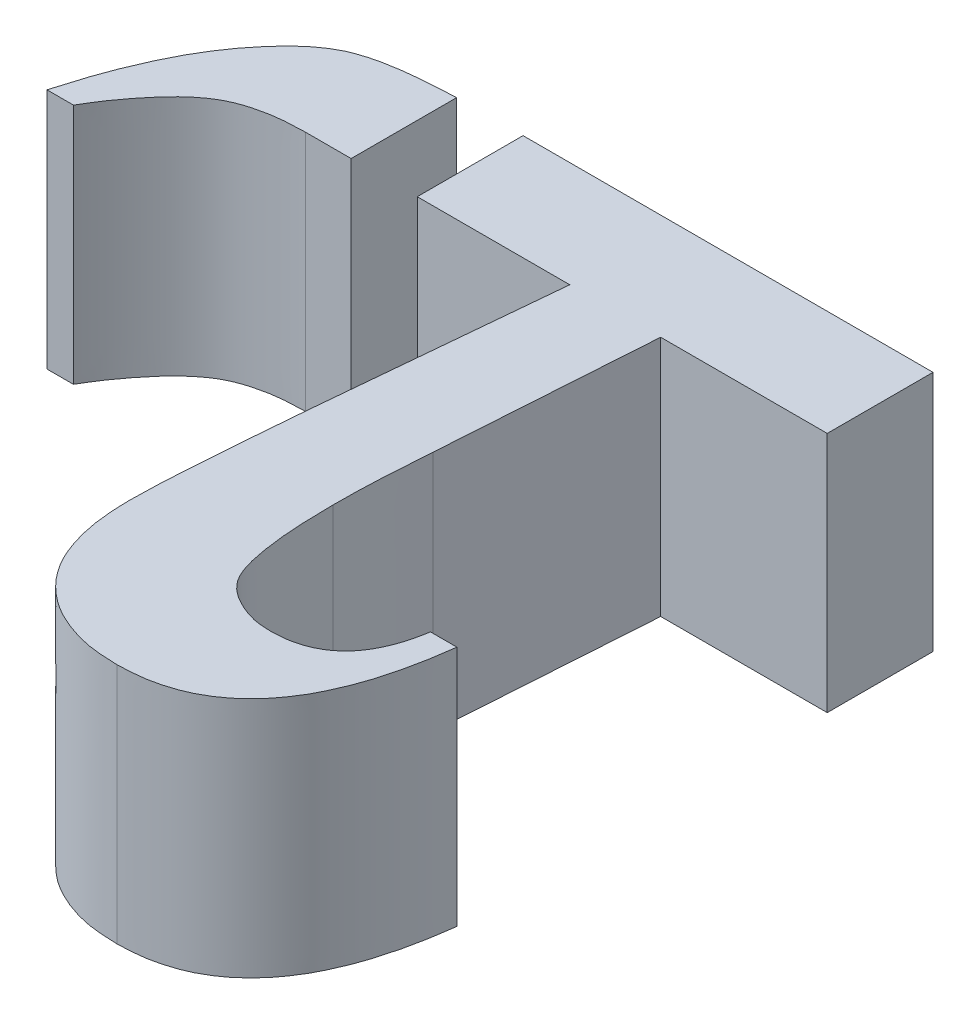
ISO-10303-21;
HEADER;
FILE_DESCRIPTION(('STEP AP214'),'2;1');
FILE_NAME('part.step','',(''),(''),'','','');
FILE_SCHEMA(('AUTOMOTIVE_DESIGN { 1 0 10303 214 1 1 1 1 }'));
ENDSEC;
DATA;
#1=APPLICATION_CONTEXT('core data for automotive mechanical design processes');
#2=APPLICATION_PROTOCOL_DEFINITION('international standard','automotive_design',2000,#1);
#3=PRODUCT_CONTEXT('',#1,'mechanical');
#4=PRODUCT('Part','Part','',(#3));
#5=PRODUCT_RELATED_PRODUCT_CATEGORY('part','',(#4));
#6=PRODUCT_DEFINITION_FORMATION('','',#4);
#7=PRODUCT_DEFINITION_CONTEXT('part definition',#1,'design');
#8=PRODUCT_DEFINITION('design','',#6,#7);
#9=PRODUCT_DEFINITION_SHAPE('','',#8);
#10=(LENGTH_UNIT() NAMED_UNIT(*) SI_UNIT(.MILLI.,.METRE.));
#11=(NAMED_UNIT(*) PLANE_ANGLE_UNIT() SI_UNIT($,.RADIAN.));
#12=(NAMED_UNIT(*) SI_UNIT($,.STERADIAN.) SOLID_ANGLE_UNIT());
#13=UNCERTAINTY_MEASURE_WITH_UNIT(LENGTH_MEASURE(1.E-05),#10,'distance_accuracy_value','');
#14=(GEOMETRIC_REPRESENTATION_CONTEXT(3) GLOBAL_UNCERTAINTY_ASSIGNED_CONTEXT((#13)) GLOBAL_UNIT_ASSIGNED_CONTEXT((#10,
#11,#12)) REPRESENTATION_CONTEXT('',''));
#15=CARTESIAN_POINT('',(0.,0.,0.));
#16=DIRECTION('',(0.,0.,1.));
#17=DIRECTION('',(1.,0.,0.));
#18=AXIS2_PLACEMENT_3D('',#15,#16,#17);
#19=CARTESIAN_POINT('',(13.2921006944444,12.7,-34.0277777777778));
#20=DIRECTION('',(0.,0.,-1.));
#21=DIRECTION('',(-1.,0.,0.));
#22=AXIS2_PLACEMENT_3D('',#19,#20,#21);
#23=PLANE('',#22);
#24=DIRECTION('',(1.,0.,0.));
#25=VECTOR('',#24,1.);
#26=CARTESIAN_POINT('',(13.2921006944444,0.,-34.0277777777778));
#27=LINE('',#26,#25);
#28=CARTESIAN_POINT('',(15.2777777777778,0.,-34.0277777777778));
#29=VERTEX_POINT('',#28);
#30=CARTESIAN_POINT('',(36.8055555555556,0.,-34.0277777777778));
#31=VERTEX_POINT('',#30);
#32=EDGE_CURVE('E150',#29,#31,#27,.T.);
#33=ORIENTED_EDGE('',*,*,#32,.F.);
#34=DIRECTION('',(0.,-1.,0.));
#35=VECTOR('',#34,1.);
#36=CARTESIAN_POINT('',(15.2777777777778,12.700012,-34.0277777777778));
#37=LINE('',#36,#35);
#38=CARTESIAN_POINT('',(15.2777777777778,12.7,-34.0277777777778));
#39=VERTEX_POINT('',#38);
#40=EDGE_CURVE('E12',#39,#29,#37,.T.);
#41=ORIENTED_EDGE('',*,*,#40,.F.);
#42=DIRECTION('',(1.,0.,0.));
#43=VECTOR('',#42,1.);
#44=CARTESIAN_POINT('',(13.2921006944444,12.7,-34.0277777777778));
#45=LINE('',#44,#43);
#46=CARTESIAN_POINT('',(36.8055555555556,12.7,-34.0277777777778));
#47=VERTEX_POINT('',#46);
#48=EDGE_CURVE('E148',#39,#47,#45,.T.);
#49=ORIENTED_EDGE('',*,*,#48,.T.);
#50=DIRECTION('',(0.,-1.,0.));
#51=VECTOR('',#50,1.);
#52=CARTESIAN_POINT('',(36.8055555555556,12.7,-34.0277777777778));
#53=LINE('',#52,#51);
#54=EDGE_CURVE('E156',#47,#31,#53,.T.);
#55=ORIENTED_EDGE('',*,*,#54,.T.);
#56=EDGE_LOOP('',(#33,#41,#49,#55));
#57=FACE_BOUND('',#56,.T.);
#58=ADVANCED_FACE('F43',(#57),#23,.T.);
#59=CARTESIAN_POINT('',(27.1472873942856,12.7,-14.7536617724148));
#60=DIRECTION('',(0.,-1.,0.));
#61=DIRECTION('',(0.,0.,-1.));
#62=AXIS2_PLACEMENT_3D('',#59,#60,#61);
#63=PLANE('',#62);
#64=DIRECTION('',(0.,0.,1.));
#65=VECTOR('',#64,1.);
#66=CARTESIAN_POINT('',(15.2777777777778,12.7,0.));
#67=LINE('',#66,#65);
#68=CARTESIAN_POINT('',(15.2777777777778,12.7,-28.4722222222222));
#69=VERTEX_POINT('',#68);
#70=EDGE_CURVE('E47',#69,#39,#67,.F.);
#71=ORIENTED_EDGE('',*,*,#70,.F.);
#72=DIRECTION('',(-1.,0.,0.));
#73=VECTOR('',#72,1.);
#74=CARTESIAN_POINT('',(23.2855902777778,12.7,-28.4722222222222));
#75=LINE('',#74,#73);
#76=CARTESIAN_POINT('',(23.2855902777778,12.7,-28.4722222222222));
#77=VERTEX_POINT('',#76);
#78=EDGE_CURVE('E200',#77,#69,#75,.T.);
#79=ORIENTED_EDGE('',*,*,#78,.F.);
#80=DIRECTION('',(0.0934043008907482,0.,-0.995628262242043));
#81=VECTOR('',#80,1.);
#82=CARTESIAN_POINT('',(22.2981770833333,12.7,-17.9470486111111));
#83=LINE('',#82,#81);
#84=CARTESIAN_POINT('',(22.2981770833333,12.7,-17.9470486111111));
#85=VERTEX_POINT('',#84);
#86=EDGE_CURVE('E193',#85,#77,#83,.T.);
#87=ORIENTED_EDGE('',*,*,#86,.F.);
#88=CARTESIAN_POINT('',(21.5277777777778,12.7,-7.12890625));
#89=CARTESIAN_POINT('',(21.5305114105295,12.7,-7.3712541198442));
#90=CARTESIAN_POINT('',(21.5366740874699,12.7,-7.91760096473992));
#91=CARTESIAN_POINT('',(21.5693216726704,12.7,-8.8258732238135));
#92=CARTESIAN_POINT('',(21.639359606474,12.7,-9.91058564289095));
#93=CARTESIAN_POINT('',(21.7259965981165,12.7,-11.1729046276854));
#94=CARTESIAN_POINT('',(21.83463501765,12.7,-12.6124561829459));
#95=CARTESIAN_POINT('',(21.9665895696574,12.7,-14.2326908476133));
#96=CARTESIAN_POINT('',(22.1147351358337,12.7,-16.0309685855275));
#97=CARTESIAN_POINT('',(22.2351680357019,12.7,-17.2889091874774));
#98=CARTESIAN_POINT('',(22.2981770833333,12.7,-17.9470486111111));
#99=B_SPLINE_CURVE_WITH_KNOTS('',3,(#88,#89,#90,#91,#92,#93,#94,#95,#96,#97,#98),.UNSPECIFIED.,
.F.,.F.,(4,1,1,1,1,1,1,1,4),(0.,0.0670238303360388,0.151097916645444,0.251302226093075,
0.367606163812109,0.501014153754002,0.65053310860966,0.817163117143853,1.),.UNSPECIFIED.);
#100=CARTESIAN_POINT('',(21.5277777777778,12.7,-7.12890625));
#101=VERTEX_POINT('',#100);
#102=EDGE_CURVE('E190',#101,#85,#99,.T.);
#103=ORIENTED_EDGE('',*,*,#102,.F.);
#104=CARTESIAN_POINT('',(28.6675347222222,12.7,0.694444444444444));
#105=CARTESIAN_POINT('',(28.1546828613466,12.7,0.675816782086769));
#106=CARTESIAN_POINT('',(27.1641312430192,12.7,0.639838242275));
#107=CARTESIAN_POINT('',(25.7663350443405,12.7,0.242024900702383));
#108=CARTESIAN_POINT('',(24.5121456190193,12.7,-0.369174112416068));
#109=CARTESIAN_POINT('',(23.6216090508016,12.7,-1.10102614918808));
#110=CARTESIAN_POINT('',(23.0102559111378,12.7,-1.79721088235984));
#111=CARTESIAN_POINT('',(22.6098523705465,12.7,-2.38381706075308));
#112=CARTESIAN_POINT('',(22.2684789361821,12.7,-3.03085897121243));
#113=CARTESIAN_POINT('',(22.0031010816414,12.7,-3.74048733214159));
#114=CARTESIAN_POINT('',(21.7829659020023,12.7,-4.50131584322859));
#115=CARTESIAN_POINT('',(21.632459474962,12.7,-5.32264207193387));
#116=CARTESIAN_POINT('',(21.5478756365024,12.7,-6.20479876889942));
#117=CARTESIAN_POINT('',(21.534625409571,12.7,-6.81404943591648));
#118=CARTESIAN_POINT('',(21.5277777777778,12.7,-7.12890625));
#119=B_SPLINE_CURVE_WITH_KNOTS('',3,(#104,#105,#106,#107,#108,#109,#110,#111,#112,#113,#114,
#115,#116,#117,#118),.UNSPECIFIED.,.F.,.F.,(4,1,1,1,1,1,1,1,1,1,1,1,4),(0.,0.127647226661698,
0.246545204552585,0.359563226304089,0.473742938345104,0.531308817831562,0.590390123598073,
0.650544045709061,0.713399872205537,0.779107018641923,0.847968041860642,0.921430864880289,1.),.UNSPECIFIED.);
#120=CARTESIAN_POINT('',(28.6675347222222,12.7,0.694444444444444));
#121=VERTEX_POINT('',#120);
#122=EDGE_CURVE('E187',#121,#101,#119,.T.);
#123=ORIENTED_EDGE('',*,*,#122,.F.);
#124=CARTESIAN_POINT('',(36.8055555555556,12.7,-9.02777777777778));
#125=CARTESIAN_POINT('',(36.7513133917469,12.7,-8.63659364157587));
#126=CARTESIAN_POINT('',(36.6454306414474,12.7,-7.87298744841802));
#127=CARTESIAN_POINT('',(36.4309932767515,12.7,-6.77107907621159));
#128=CARTESIAN_POINT('',(36.16669150045,12.7,-5.74350517199164));
#129=CARTESIAN_POINT('',(35.8738258854762,12.7,-4.78809617206142));
#130=CARTESIAN_POINT('',(35.5036386424438,12.7,-3.9183087219052));
#131=CARTESIAN_POINT('',(35.1264384283411,12.7,-3.10889015714418));
#132=CARTESIAN_POINT('',(34.6702223597116,12.7,-2.39005292028029));
#133=CARTESIAN_POINT('',(34.1904600364056,12.7,-1.73473575157518));
#134=CARTESIAN_POINT('',(33.6477015498479,12.7,-1.16770850492629));
#135=CARTESIAN_POINT('',(33.078282467188,12.7,-0.66136398505755));
#136=CARTESIAN_POINT('',(32.4475265168622,12.7,-0.251271838106295));
#137=CARTESIAN_POINT('',(31.7856191750121,12.7,0.107880779261864));
#138=CARTESIAN_POINT('',(31.0640591850801,12.7,0.356214557009295));
#139=CARTESIAN_POINT('',(30.3088261221695,12.7,0.56350053559861));
#140=CARTESIAN_POINT('',(29.5020634030454,12.7,0.664205140721047));
#141=CARTESIAN_POINT('',(28.9498434871648,12.7,0.684214933244837));
#142=CARTESIAN_POINT('',(28.6675347222222,12.7,0.694444444444444));
#143=B_SPLINE_CURVE_WITH_KNOTS('',3,(#124,#125,#126,#127,#128,#129,#130,#131,#132,#133,#134,
#135,#136,#137,#138,#139,#140,#141,#142),.UNSPECIFIED.,.F.,.F.,(4,1,1,1,1,1,1,1,1,1,1,1,1,1,1,1,
4),(0.,0.0841556864895232,0.164275075203153,0.239055219457782,0.310237014412085,
0.376941840256964,0.440373169741991,0.500263392341492,0.558073875988856,0.613147443853041,
0.667241364146044,0.720045825452029,0.773142026333451,0.827274375356327,0.882239955728648,
0.93979809184389,1.),.UNSPECIFIED.);
#144=CARTESIAN_POINT('',(36.8055555555556,12.7,-9.02777777777778));
#145=VERTEX_POINT('',#144);
#146=EDGE_CURVE('E184',#145,#121,#143,.T.);
#147=ORIENTED_EDGE('',*,*,#146,.F.);
#148=DIRECTION('',(1.,0.,0.));
#149=VECTOR('',#148,1.);
#150=CARTESIAN_POINT('',(35.4166666666667,12.7,-9.02777777777778));
#151=LINE('',#150,#149);
#152=CARTESIAN_POINT('',(35.4166666666667,12.7,-9.02777777777778));
#153=VERTEX_POINT('',#152);
#154=EDGE_CURVE('E181',#153,#145,#151,.T.);
#155=ORIENTED_EDGE('',*,*,#154,.F.);
#156=CARTESIAN_POINT('',(31.1957465277778,12.7,-4.86111111111111));
#157=CARTESIAN_POINT('',(31.4791658501184,12.7,-4.8721360880485));
#158=CARTESIAN_POINT('',(32.020929674091,12.7,-4.89321063446786));
#159=CARTESIAN_POINT('',(32.7882207905975,12.7,-5.09409905053723));
#160=CARTESIAN_POINT('',(33.4661075286299,12.7,-5.42321156735885));
#161=CARTESIAN_POINT('',(34.0525941602721,12.7,-5.89132585546645));
#162=CARTESIAN_POINT('',(34.5489539983316,12.7,-6.48840022572338));
#163=CARTESIAN_POINT('',(34.9362207251512,12.7,-7.22238630970373));
#164=CARTESIAN_POINT('',(35.2449863982341,12.7,-8.07647376134501));
#165=CARTESIAN_POINT('',(35.3574861135008,12.7,-8.69985018053333));
#166=CARTESIAN_POINT('',(35.4166666666667,12.7,-9.02777777777778));
#167=B_SPLINE_CURVE_WITH_KNOTS('',3,(#156,#157,#158,#159,#160,#161,#162,#163,#164,#165,#166),
.UNSPECIFIED.,.F.,.F.,(4,1,1,1,1,1,1,1,4),(0.,0.129205983290068,0.246980788074976,
0.35925367724387,0.470941934680579,0.587037155352566,0.711204670771874,0.848079016956545,1.),.UNSPECIFIED.);
#168=CARTESIAN_POINT('',(31.1957465277778,12.7,-4.86111111111111));
#169=VERTEX_POINT('',#168);
#170=EDGE_CURVE('E178',#169,#153,#167,.T.);
#171=ORIENTED_EDGE('',*,*,#170,.F.);
#172=CARTESIAN_POINT('',(27.0833333333333,12.7,-12.2287326388889));
#173=CARTESIAN_POINT('',(27.0882745812644,12.7,-11.8236043185145));
#174=CARTESIAN_POINT('',(27.0976765216824,12.7,-11.052747971514));
#175=CARTESIAN_POINT('',(27.1463748998904,12.7,-9.95891993945998));
#176=CARTESIAN_POINT('',(27.2451702705584,12.7,-8.98875586176693));
#177=CARTESIAN_POINT('',(27.3710026926128,12.7,-8.14392613457271));
#178=CARTESIAN_POINT('',(27.5291522325583,12.7,-7.41943052756003));
#179=CARTESIAN_POINT('',(27.7284573341644,12.7,-6.81830163856045));
#180=CARTESIAN_POINT('',(27.9765063600137,12.7,-6.33946446408178));
#181=CARTESIAN_POINT('',(28.3522272213898,12.7,-5.8784454175766));
#182=CARTESIAN_POINT('',(28.9025466939934,12.7,-5.47047020970769));
#183=CARTESIAN_POINT('',(29.6120223329737,12.7,-5.12581615996723));
#184=CARTESIAN_POINT('',(30.3815459637492,12.7,-4.88809905815676));
#185=CARTESIAN_POINT('',(30.9190270918066,12.7,-4.87028340822614));
#186=CARTESIAN_POINT('',(31.1957465277778,12.7,-4.86111111111111));
#187=B_SPLINE_CURVE_WITH_KNOTS('',3,(#172,#173,#174,#175,#176,#177,#178,#179,#180,#181,#182,
#183,#184,#185,#186),.UNSPECIFIED.,.F.,.F.,(4,1,1,1,1,1,1,1,1,1,1,1,4),(0.,0.125676685120686,
0.239130827254309,0.339492232966841,0.42803269094699,0.503968671969276,0.56925330075194,
0.623964141319684,0.670222681451672,0.752583670617675,0.83386779813621,0.914467677474434,1.),.UNSPECIFIED.);
#188=CARTESIAN_POINT('',(27.0833333333333,12.7,-12.2287326388889));
#189=VERTEX_POINT('',#188);
#190=EDGE_CURVE('E175',#189,#169,#187,.T.);
#191=ORIENTED_EDGE('',*,*,#190,.F.);
#192=CARTESIAN_POINT('',(27.3111979166667,12.7,-17.2743055555556));
#193=CARTESIAN_POINT('',(27.2777956556052,12.7,-16.8041666391725));
#194=CARTESIAN_POINT('',(27.2135818740465,12.7,-15.9003536421008));
#195=CARTESIAN_POINT('',(27.1342842848992,12.7,-14.5912792307124));
#196=CARTESIAN_POINT('',(27.0883448225416,12.7,-13.379251722667));
#197=CARTESIAN_POINT('',(27.0849562140775,12.7,-12.6013075740456));
#198=CARTESIAN_POINT('',(27.0833333333333,12.7,-12.2287326388889));
#199=B_SPLINE_CURVE_WITH_KNOTS('',3,(#192,#193,#194,#195,#196,#197,#198),.UNSPECIFIED.,.F.,.F.,
(4,1,1,1,4),(0.,0.279883091977313,0.538057938568128,0.778765565768248,1.),.UNSPECIFIED.);
#200=CARTESIAN_POINT('',(27.3111979166667,12.7,-17.2743055555556));
#201=VERTEX_POINT('',#200);
#202=EDGE_CURVE('E172',#201,#189,#199,.T.);
#203=ORIENTED_EDGE('',*,*,#202,.F.);
#204=DIRECTION('',(-0.0667115204065151,0.,0.997772305210488));
#205=VECTOR('',#204,1.);
#206=CARTESIAN_POINT('',(28.0598958333333,12.7,-28.4722222222222));
#207=LINE('',#206,#205);
#208=CARTESIAN_POINT('',(28.0598958333333,12.7,-28.4722222222222));
#209=VERTEX_POINT('',#208);
#210=EDGE_CURVE('E169',#209,#201,#207,.T.);
#211=ORIENTED_EDGE('',*,*,#210,.F.);
#212=DIRECTION('',(-1.,0.,0.));
#213=VECTOR('',#212,1.);
#214=CARTESIAN_POINT('',(36.8055555555556,12.7,-28.4722222222222));
#215=LINE('',#214,#213);
#216=CARTESIAN_POINT('',(36.8055555555556,12.7,-28.4722222222222));
#217=VERTEX_POINT('',#216);
#218=EDGE_CURVE('E166',#217,#209,#215,.T.);
#219=ORIENTED_EDGE('',*,*,#218,.F.);
#220=DIRECTION('',(0.,0.,1.));
#221=VECTOR('',#220,1.);
#222=CARTESIAN_POINT('',(36.8055555555556,12.7,-34.0277777777778));
#223=LINE('',#222,#221);
#224=EDGE_CURVE('E155',#47,#217,#223,.T.);
#225=ORIENTED_EDGE('',*,*,#224,.F.);
#226=ORIENTED_EDGE('',*,*,#48,.F.);
#227=EDGE_LOOP('',(#71,#79,#87,#103,#123,#147,#155,#171,#191,#203,#211,#219,#225,#226));
#228=FACE_BOUND('',#227,.T.);
#229=ADVANCED_FACE('F152',(#228),#63,.F.);
#230=CARTESIAN_POINT('',(27.1472873942856,0.,-14.7536617724148));
#231=DIRECTION('',(0.,-1.,0.));
#232=DIRECTION('',(0.,0.,-1.));
#233=AXIS2_PLACEMENT_3D('',#230,#231,#232);
#234=PLANE('',#233);
#235=DIRECTION('',(-1.,0.,0.));
#236=VECTOR('',#235,1.);
#237=CARTESIAN_POINT('',(23.2855902777778,0.,-28.4722222222222));
#238=LINE('',#237,#236);
#239=CARTESIAN_POINT('',(23.2855902777778,0.,-28.4722222222222));
#240=VERTEX_POINT('',#239);
#241=CARTESIAN_POINT('',(15.2777777777778,0.,-28.4722222222222));
#242=VERTEX_POINT('',#241);
#243=EDGE_CURVE('E158',#240,#242,#238,.T.);
#244=ORIENTED_EDGE('',*,*,#243,.T.);
#245=DIRECTION('',(0.,0.,-1.));
#246=VECTOR('',#245,1.);
#247=CARTESIAN_POINT('',(15.2777777777778,0.,0.));
#248=LINE('',#247,#246);
#249=EDGE_CURVE('E196',#242,#29,#248,.T.);
#250=ORIENTED_EDGE('',*,*,#249,.T.);
#251=ORIENTED_EDGE('',*,*,#32,.T.);
#252=DIRECTION('',(0.,0.,1.));
#253=VECTOR('',#252,1.);
#254=CARTESIAN_POINT('',(36.8055555555556,0.,-34.0277777777778));
#255=LINE('',#254,#253);
#256=CARTESIAN_POINT('',(36.8055555555556,0.,-28.4722222222222));
#257=VERTEX_POINT('',#256);
#258=EDGE_CURVE('E258',#31,#257,#255,.T.);
#259=ORIENTED_EDGE('',*,*,#258,.T.);
#260=DIRECTION('',(-1.,0.,0.));
#261=VECTOR('',#260,1.);
#262=CARTESIAN_POINT('',(36.8055555555556,0.,-28.4722222222222));
#263=LINE('',#262,#261);
#264=CARTESIAN_POINT('',(28.0598958333333,0.,-28.4722222222222));
#265=VERTEX_POINT('',#264);
#266=EDGE_CURVE('E255',#257,#265,#263,.T.);
#267=ORIENTED_EDGE('',*,*,#266,.T.);
#268=DIRECTION('',(-0.0667115204065151,0.,0.997772305210488));
#269=VECTOR('',#268,1.);
#270=CARTESIAN_POINT('',(28.0598958333333,0.,-28.4722222222222));
#271=LINE('',#270,#269);
#272=CARTESIAN_POINT('',(27.3111979166667,0.,-17.2743055555556));
#273=VERTEX_POINT('',#272);
#274=EDGE_CURVE('E249',#265,#273,#271,.T.);
#275=ORIENTED_EDGE('',*,*,#274,.T.);
#276=CARTESIAN_POINT('',(27.3111979166667,0.,-17.2743055555556));
#277=CARTESIAN_POINT('',(27.2777956556052,0.,-16.8041666391725));
#278=CARTESIAN_POINT('',(27.2135818740465,0.,-15.9003536421008));
#279=CARTESIAN_POINT('',(27.1342842848992,0.,-14.5912792307124));
#280=CARTESIAN_POINT('',(27.0883448225416,0.,-13.379251722667));
#281=CARTESIAN_POINT('',(27.0849562140775,0.,-12.6013075740456));
#282=CARTESIAN_POINT('',(27.0833333333333,0.,-12.2287326388889));
#283=B_SPLINE_CURVE_WITH_KNOTS('',3,(#276,#277,#278,#279,#280,#281,#282),.UNSPECIFIED.,.F.,.F.,
(4,1,1,1,4),(0.,0.279883091977313,0.538057938568128,0.778765565768248,1.),.UNSPECIFIED.);
#284=CARTESIAN_POINT('',(27.0833333333333,0.,-12.2287326388889));
#285=VERTEX_POINT('',#284);
#286=EDGE_CURVE('E241',#273,#285,#283,.T.);
#287=ORIENTED_EDGE('',*,*,#286,.T.);
#288=CARTESIAN_POINT('',(27.0833333333333,0.,-12.2287326388889));
#289=CARTESIAN_POINT('',(27.0882745812644,0.,-11.8236043185145));
#290=CARTESIAN_POINT('',(27.0976765216824,0.,-11.052747971514));
#291=CARTESIAN_POINT('',(27.1463748998904,0.,-9.95891993945998));
#292=CARTESIAN_POINT('',(27.2451702705584,0.,-8.98875586176693));
#293=CARTESIAN_POINT('',(27.3710026926128,0.,-8.14392613457271));
#294=CARTESIAN_POINT('',(27.5291522325583,0.,-7.41943052756003));
#295=CARTESIAN_POINT('',(27.7284573341644,0.,-6.81830163856045));
#296=CARTESIAN_POINT('',(27.9765063600137,0.,-6.33946446408178));
#297=CARTESIAN_POINT('',(28.3522272213898,0.,-5.8784454175766));
#298=CARTESIAN_POINT('',(28.9025466939934,0.,-5.47047020970769));
#299=CARTESIAN_POINT('',(29.6120223329737,0.,-5.12581615996723));
#300=CARTESIAN_POINT('',(30.3815459637492,0.,-4.88809905815676));
#301=CARTESIAN_POINT('',(30.9190270918066,0.,-4.87028340822614));
#302=CARTESIAN_POINT('',(31.1957465277778,0.,-4.86111111111111));
#303=B_SPLINE_CURVE_WITH_KNOTS('',3,(#288,#289,#290,#291,#292,#293,#294,#295,#296,#297,#298,
#299,#300,#301,#302),.UNSPECIFIED.,.F.,.F.,(4,1,1,1,1,1,1,1,1,1,1,1,4),(0.,0.125676685120686,
0.239130827254309,0.339492232966841,0.42803269094699,0.503968671969276,0.56925330075194,
0.623964141319684,0.670222681451672,0.752583670617675,0.83386779813621,0.914467677474434,1.),.UNSPECIFIED.);
#304=CARTESIAN_POINT('',(31.1957465277778,0.,-4.86111111111111));
#305=VERTEX_POINT('',#304);
#306=EDGE_CURVE('E233',#285,#305,#303,.T.);
#307=ORIENTED_EDGE('',*,*,#306,.T.);
#308=CARTESIAN_POINT('',(31.1957465277778,0.,-4.86111111111111));
#309=CARTESIAN_POINT('',(31.4791658501184,0.,-4.8721360880485));
#310=CARTESIAN_POINT('',(32.020929674091,0.,-4.89321063446786));
#311=CARTESIAN_POINT('',(32.7882207905975,0.,-5.09409905053723));
#312=CARTESIAN_POINT('',(33.4661075286299,0.,-5.42321156735885));
#313=CARTESIAN_POINT('',(34.0525941602721,0.,-5.89132585546645));
#314=CARTESIAN_POINT('',(34.5489539983316,0.,-6.48840022572338));
#315=CARTESIAN_POINT('',(34.9362207251512,0.,-7.22238630970373));
#316=CARTESIAN_POINT('',(35.2449863982341,0.,-8.07647376134501));
#317=CARTESIAN_POINT('',(35.3574861135008,0.,-8.69985018053333));
#318=CARTESIAN_POINT('',(35.4166666666667,0.,-9.02777777777778));
#319=B_SPLINE_CURVE_WITH_KNOTS('',3,(#308,#309,#310,#311,#312,#313,#314,#315,#316,#317,#318),
.UNSPECIFIED.,.F.,.F.,(4,1,1,1,1,1,1,1,4),(0.,0.129205983290068,0.246980788074976,
0.35925367724387,0.470941934680579,0.587037155352566,0.711204670771874,0.848079016956545,1.),.UNSPECIFIED.);
#320=CARTESIAN_POINT('',(35.4166666666667,0.,-9.02777777777778));
#321=VERTEX_POINT('',#320);
#322=EDGE_CURVE('E228',#305,#321,#319,.T.);
#323=ORIENTED_EDGE('',*,*,#322,.T.);
#324=DIRECTION('',(1.,0.,0.));
#325=VECTOR('',#324,1.);
#326=CARTESIAN_POINT('',(35.4166666666667,0.,-9.02777777777778));
#327=LINE('',#326,#325);
#328=CARTESIAN_POINT('',(36.8055555555556,0.,-9.02777777777778));
#329=VERTEX_POINT('',#328);
#330=EDGE_CURVE('E222',#321,#329,#327,.T.);
#331=ORIENTED_EDGE('',*,*,#330,.T.);
#332=CARTESIAN_POINT('',(36.8055555555556,0.,-9.02777777777778));
#333=CARTESIAN_POINT('',(36.7513133917469,0.,-8.63659364157587));
#334=CARTESIAN_POINT('',(36.6454306414474,0.,-7.87298744841802));
#335=CARTESIAN_POINT('',(36.4309932767515,0.,-6.77107907621159));
#336=CARTESIAN_POINT('',(36.16669150045,0.,-5.74350517199164));
#337=CARTESIAN_POINT('',(35.8738258854762,0.,-4.78809617206142));
#338=CARTESIAN_POINT('',(35.5036386424438,0.,-3.9183087219052));
#339=CARTESIAN_POINT('',(35.1264384283411,0.,-3.10889015714418));
#340=CARTESIAN_POINT('',(34.6702223597116,0.,-2.39005292028029));
#341=CARTESIAN_POINT('',(34.1904600364056,0.,-1.73473575157518));
#342=CARTESIAN_POINT('',(33.6477015498479,0.,-1.16770850492629));
#343=CARTESIAN_POINT('',(33.078282467188,0.,-0.66136398505755));
#344=CARTESIAN_POINT('',(32.4475265168622,0.,-0.251271838106295));
#345=CARTESIAN_POINT('',(31.7856191750121,0.,0.107880779261864));
#346=CARTESIAN_POINT('',(31.0640591850801,0.,0.356214557009295));
#347=CARTESIAN_POINT('',(30.3088261221695,0.,0.56350053559861));
#348=CARTESIAN_POINT('',(29.5020634030454,0.,0.664205140721047));
#349=CARTESIAN_POINT('',(28.9498434871648,0.,0.684214933244837));
#350=CARTESIAN_POINT('',(28.6675347222222,0.,0.694444444444444));
#351=B_SPLINE_CURVE_WITH_KNOTS('',3,(#332,#333,#334,#335,#336,#337,#338,#339,#340,#341,#342,
#343,#344,#345,#346,#347,#348,#349,#350),.UNSPECIFIED.,.F.,.F.,(4,1,1,1,1,1,1,1,1,1,1,1,1,1,1,1,
4),(0.,0.0841556864895232,0.164275075203153,0.239055219457782,0.310237014412085,
0.376941840256964,0.440373169741991,0.500263392341492,0.558073875988856,0.613147443853041,
0.667241364146044,0.720045825452029,0.773142026333451,0.827274375356327,0.882239955728648,
0.93979809184389,1.),.UNSPECIFIED.);
#352=CARTESIAN_POINT('',(28.6675347222222,0.,0.694444444444444));
#353=VERTEX_POINT('',#352);
#354=EDGE_CURVE('E214',#329,#353,#351,.T.);
#355=ORIENTED_EDGE('',*,*,#354,.T.);
#356=CARTESIAN_POINT('',(28.6675347222222,0.,0.694444444444444));
#357=CARTESIAN_POINT('',(28.1546828613466,0.,0.675816782086769));
#358=CARTESIAN_POINT('',(27.1641312430192,0.,0.639838242275));
#359=CARTESIAN_POINT('',(25.7663350443405,0.,0.242024900702383));
#360=CARTESIAN_POINT('',(24.5121456190193,0.,-0.369174112416068));
#361=CARTESIAN_POINT('',(23.6216090508016,0.,-1.10102614918808));
#362=CARTESIAN_POINT('',(23.0102559111378,0.,-1.79721088235984));
#363=CARTESIAN_POINT('',(22.6098523705465,0.,-2.38381706075308));
#364=CARTESIAN_POINT('',(22.2684789361821,0.,-3.03085897121243));
#365=CARTESIAN_POINT('',(22.0031010816414,0.,-3.74048733214159));
#366=CARTESIAN_POINT('',(21.7829659020023,0.,-4.50131584322859));
#367=CARTESIAN_POINT('',(21.632459474962,0.,-5.32264207193387));
#368=CARTESIAN_POINT('',(21.5478756365024,0.,-6.20479876889942));
#369=CARTESIAN_POINT('',(21.534625409571,0.,-6.81404943591648));
#370=CARTESIAN_POINT('',(21.5277777777778,0.,-7.12890625));
#371=B_SPLINE_CURVE_WITH_KNOTS('',3,(#356,#357,#358,#359,#360,#361,#362,#363,#364,#365,#366,
#367,#368,#369,#370),.UNSPECIFIED.,.F.,.F.,(4,1,1,1,1,1,1,1,1,1,1,1,4),(0.,0.127647226661698,
0.246545204552585,0.359563226304089,0.473742938345104,0.531308817831562,0.590390123598073,
0.650544045709061,0.713399872205537,0.779107018641923,0.847968041860642,0.921430864880289,1.),.UNSPECIFIED.);
#372=CARTESIAN_POINT('',(21.5277777777778,0.,-7.12890625));
#373=VERTEX_POINT('',#372);
#374=EDGE_CURVE('E206',#353,#373,#371,.T.);
#375=ORIENTED_EDGE('',*,*,#374,.T.);
#376=CARTESIAN_POINT('',(21.5277777777778,0.,-7.12890625));
#377=CARTESIAN_POINT('',(21.5305114105295,0.,-7.3712541198442));
#378=CARTESIAN_POINT('',(21.5366740874699,0.,-7.91760096473992));
#379=CARTESIAN_POINT('',(21.5693216726704,0.,-8.8258732238135));
#380=CARTESIAN_POINT('',(21.639359606474,0.,-9.91058564289095));
#381=CARTESIAN_POINT('',(21.7259965981165,0.,-11.1729046276854));
#382=CARTESIAN_POINT('',(21.83463501765,0.,-12.6124561829459));
#383=CARTESIAN_POINT('',(21.9665895696574,0.,-14.2326908476133));
#384=CARTESIAN_POINT('',(22.1147351358337,0.,-16.0309685855275));
#385=CARTESIAN_POINT('',(22.2351680357019,0.,-17.2889091874774));
#386=CARTESIAN_POINT('',(22.2981770833333,0.,-17.9470486111111));
#387=B_SPLINE_CURVE_WITH_KNOTS('',3,(#376,#377,#378,#379,#380,#381,#382,#383,#384,#385,#386),
.UNSPECIFIED.,.F.,.F.,(4,1,1,1,1,1,1,1,4),(0.,0.0670238303360388,0.151097916645444,
0.251302226093075,0.367606163812109,0.501014153754002,0.65053310860966,0.817163117143853,1.),.UNSPECIFIED.);
#388=CARTESIAN_POINT('',(22.2981770833333,0.,-17.9470486111111));
#389=VERTEX_POINT('',#388);
#390=EDGE_CURVE('E201',#373,#389,#387,.T.);
#391=ORIENTED_EDGE('',*,*,#390,.T.);
#392=DIRECTION('',(0.0934043008907482,0.,-0.995628262242043));
#393=VECTOR('',#392,1.);
#394=CARTESIAN_POINT('',(22.2981770833333,0.,-17.9470486111111));
#395=LINE('',#394,#393);
#396=EDGE_CURVE('E197',#389,#240,#395,.T.);
#397=ORIENTED_EDGE('',*,*,#396,.T.);
#398=EDGE_LOOP('',(#244,#250,#251,#259,#267,#275,#287,#307,#323,#331,#355,#375,#391,#397));
#399=FACE_BOUND('',#398,.T.);
#400=ADVANCED_FACE('F45',(#399),#234,.T.);
#401=CARTESIAN_POINT('',(23.2855902777778,12.7,-28.4722222222222));
#402=DIRECTION('',(0.,0.,1.));
#403=DIRECTION('',(1.,0.,0.));
#404=AXIS2_PLACEMENT_3D('',#401,#402,#403);
#405=PLANE('',#404);
#406=ORIENTED_EDGE('',*,*,#243,.F.);
#407=DIRECTION('',(0.,-1.,0.));
#408=VECTOR('',#407,1.);
#409=CARTESIAN_POINT('',(23.2855902777778,12.7,-28.4722222222222));
#410=LINE('',#409,#408);
#411=EDGE_CURVE('E191',#77,#240,#410,.T.);
#412=ORIENTED_EDGE('',*,*,#411,.F.);
#413=ORIENTED_EDGE('',*,*,#78,.T.);
#414=DIRECTION('',(0.,-1.,0.));
#415=VECTOR('',#414,1.);
#416=CARTESIAN_POINT('',(15.2777777777778,12.7,-28.4722222222222));
#417=LINE('',#416,#415);
#418=EDGE_CURVE('E60',#69,#242,#417,.T.);
#419=ORIENTED_EDGE('',*,*,#418,.T.);
#420=EDGE_LOOP('',(#406,#412,#413,#419));
#421=FACE_BOUND('',#420,.T.);
#422=ADVANCED_FACE('F287',(#421),#405,.T.);
#423=CARTESIAN_POINT('',(22.2981770833333,12.7,-17.9470486111111));
#424=DIRECTION('',(-0.995628262242043,0.,-0.0934043008907482));
#425=DIRECTION('',(-0.0934043008907482,0.,0.995628262242043));
#426=AXIS2_PLACEMENT_3D('',#423,#424,#425);
#427=PLANE('',#426);
#428=ORIENTED_EDGE('',*,*,#396,.F.);
#429=DIRECTION('',(0.,-1.,0.));
#430=VECTOR('',#429,1.);
#431=CARTESIAN_POINT('',(22.2981770833333,12.7,-17.9470486111111));
#432=LINE('',#431,#430);
#433=EDGE_CURVE('E188',#85,#389,#432,.T.);
#434=ORIENTED_EDGE('',*,*,#433,.F.);
#435=ORIENTED_EDGE('',*,*,#86,.T.);
#436=ORIENTED_EDGE('',*,*,#411,.T.);
#437=EDGE_LOOP('',(#428,#434,#435,#436));
#438=FACE_BOUND('',#437,.T.);
#439=ADVANCED_FACE('F282',(#438),#427,.T.);
#440=DIRECTION('',(0.,-1.,0.));
#441=VECTOR('',#440,1.);
#442=SURFACE_OF_LINEAR_EXTRUSION('',#99,#441);
#443=ORIENTED_EDGE('',*,*,#390,.F.);
#444=DIRECTION('',(0.,-1.,0.));
#445=VECTOR('',#444,1.);
#446=CARTESIAN_POINT('',(21.5277777777778,12.7,-7.12890625));
#447=LINE('',#446,#445);
#448=EDGE_CURVE('E185',#101,#373,#447,.T.);
#449=ORIENTED_EDGE('',*,*,#448,.F.);
#450=ORIENTED_EDGE('',*,*,#102,.T.);
#451=ORIENTED_EDGE('',*,*,#433,.T.);
#452=EDGE_LOOP('',(#443,#449,#450,#451));
#453=FACE_BOUND('',#452,.T.);
#454=ADVANCED_FACE('F277',(#453),#442,.T.);
#455=DIRECTION('',(0.,-1.,0.));
#456=VECTOR('',#455,1.);
#457=SURFACE_OF_LINEAR_EXTRUSION('',#119,#456);
#458=ORIENTED_EDGE('',*,*,#374,.F.);
#459=DIRECTION('',(0.,-1.,0.));
#460=VECTOR('',#459,1.);
#461=CARTESIAN_POINT('',(28.6675347222222,12.7,0.694444444444444));
#462=LINE('',#461,#460);
#463=EDGE_CURVE('E182',#121,#353,#462,.T.);
#464=ORIENTED_EDGE('',*,*,#463,.F.);
#465=ORIENTED_EDGE('',*,*,#122,.T.);
#466=ORIENTED_EDGE('',*,*,#448,.T.);
#467=EDGE_LOOP('',(#458,#464,#465,#466));
#468=FACE_BOUND('',#467,.T.);
#469=ADVANCED_FACE('F281',(#468),#457,.T.);
#470=DIRECTION('',(0.,-1.,0.));
#471=VECTOR('',#470,1.);
#472=SURFACE_OF_LINEAR_EXTRUSION('',#143,#471);
#473=ORIENTED_EDGE('',*,*,#354,.F.);
#474=DIRECTION('',(0.,-1.,0.));
#475=VECTOR('',#474,1.);
#476=CARTESIAN_POINT('',(36.8055555555556,12.7,-9.02777777777778));
#477=LINE('',#476,#475);
#478=EDGE_CURVE('E179',#145,#329,#477,.T.);
#479=ORIENTED_EDGE('',*,*,#478,.F.);
#480=ORIENTED_EDGE('',*,*,#146,.T.);
#481=ORIENTED_EDGE('',*,*,#463,.T.);
#482=EDGE_LOOP('',(#473,#479,#480,#481));
#483=FACE_BOUND('',#482,.T.);
#484=ADVANCED_FACE('F352',(#483),#472,.T.);
#485=CARTESIAN_POINT('',(35.4166666666667,12.7,-9.02777777777778));
#486=DIRECTION('',(0.,0.,-1.));
#487=DIRECTION('',(-1.,0.,0.));
#488=AXIS2_PLACEMENT_3D('',#485,#486,#487);
#489=PLANE('',#488);
#490=ORIENTED_EDGE('',*,*,#330,.F.);
#491=DIRECTION('',(0.,-1.,0.));
#492=VECTOR('',#491,1.);
#493=CARTESIAN_POINT('',(35.4166666666667,12.7,-9.02777777777778));
#494=LINE('',#493,#492);
#495=EDGE_CURVE('E176',#153,#321,#494,.T.);
#496=ORIENTED_EDGE('',*,*,#495,.F.);
#497=ORIENTED_EDGE('',*,*,#154,.T.);
#498=ORIENTED_EDGE('',*,*,#478,.T.);
#499=EDGE_LOOP('',(#490,#496,#497,#498));
#500=FACE_BOUND('',#499,.T.);
#501=ADVANCED_FACE('F364',(#500),#489,.T.);
#502=DIRECTION('',(0.,-1.,0.));
#503=VECTOR('',#502,1.);
#504=SURFACE_OF_LINEAR_EXTRUSION('',#167,#503);
#505=ORIENTED_EDGE('',*,*,#322,.F.);
#506=DIRECTION('',(0.,-1.,0.));
#507=VECTOR('',#506,1.);
#508=CARTESIAN_POINT('',(31.1957465277778,12.7,-4.86111111111111));
#509=LINE('',#508,#507);
#510=EDGE_CURVE('E173',#169,#305,#509,.T.);
#511=ORIENTED_EDGE('',*,*,#510,.F.);
#512=ORIENTED_EDGE('',*,*,#170,.T.);
#513=ORIENTED_EDGE('',*,*,#495,.T.);
#514=EDGE_LOOP('',(#505,#511,#512,#513));
#515=FACE_BOUND('',#514,.T.);
#516=ADVANCED_FACE('F366',(#515),#504,.T.);
#517=DIRECTION('',(0.,-1.,0.));
#518=VECTOR('',#517,1.);
#519=SURFACE_OF_LINEAR_EXTRUSION('',#187,#518);
#520=ORIENTED_EDGE('',*,*,#306,.F.);
#521=DIRECTION('',(0.,-1.,0.));
#522=VECTOR('',#521,1.);
#523=CARTESIAN_POINT('',(27.0833333333333,12.7,-12.2287326388889));
#524=LINE('',#523,#522);
#525=EDGE_CURVE('E170',#189,#285,#524,.T.);
#526=ORIENTED_EDGE('',*,*,#525,.F.);
#527=ORIENTED_EDGE('',*,*,#190,.T.);
#528=ORIENTED_EDGE('',*,*,#510,.T.);
#529=EDGE_LOOP('',(#520,#526,#527,#528));
#530=FACE_BOUND('',#529,.T.);
#531=ADVANCED_FACE('F319',(#530),#519,.T.);
#532=DIRECTION('',(0.,-1.,0.));
#533=VECTOR('',#532,1.);
#534=SURFACE_OF_LINEAR_EXTRUSION('',#199,#533);
#535=ORIENTED_EDGE('',*,*,#286,.F.);
#536=DIRECTION('',(0.,-1.,0.));
#537=VECTOR('',#536,1.);
#538=CARTESIAN_POINT('',(27.3111979166667,12.7,-17.2743055555556));
#539=LINE('',#538,#537);
#540=EDGE_CURVE('E167',#201,#273,#539,.T.);
#541=ORIENTED_EDGE('',*,*,#540,.F.);
#542=ORIENTED_EDGE('',*,*,#202,.T.);
#543=ORIENTED_EDGE('',*,*,#525,.T.);
#544=EDGE_LOOP('',(#535,#541,#542,#543));
#545=FACE_BOUND('',#544,.T.);
#546=ADVANCED_FACE('F314',(#545),#534,.T.);
#547=CARTESIAN_POINT('',(28.0598958333333,12.7,-28.4722222222222));
#548=DIRECTION('',(0.997772305210488,0.,0.0667115204065151));
#549=DIRECTION('',(0.0667115204065151,0.,-0.997772305210488));
#550=AXIS2_PLACEMENT_3D('',#547,#548,#549);
#551=PLANE('',#550);
#552=ORIENTED_EDGE('',*,*,#274,.F.);
#553=DIRECTION('',(0.,-1.,0.));
#554=VECTOR('',#553,1.);
#555=CARTESIAN_POINT('',(28.0598958333333,12.7,-28.4722222222222));
#556=LINE('',#555,#554);
#557=EDGE_CURVE('E164',#209,#265,#556,.T.);
#558=ORIENTED_EDGE('',*,*,#557,.F.);
#559=ORIENTED_EDGE('',*,*,#210,.T.);
#560=ORIENTED_EDGE('',*,*,#540,.T.);
#561=EDGE_LOOP('',(#552,#558,#559,#560));
#562=FACE_BOUND('',#561,.T.);
#563=ADVANCED_FACE('F310',(#562),#551,.T.);
#564=CARTESIAN_POINT('',(36.8055555555556,12.7,-28.4722222222222));
#565=DIRECTION('',(0.,0.,1.));
#566=DIRECTION('',(1.,0.,0.));
#567=AXIS2_PLACEMENT_3D('',#564,#565,#566);
#568=PLANE('',#567);
#569=ORIENTED_EDGE('',*,*,#266,.F.);
#570=DIRECTION('',(0.,-1.,0.));
#571=VECTOR('',#570,1.);
#572=CARTESIAN_POINT('',(36.8055555555556,12.7,-28.4722222222222));
#573=LINE('',#572,#571);
#574=EDGE_CURVE('E144',#217,#257,#573,.T.);
#575=ORIENTED_EDGE('',*,*,#574,.F.);
#576=ORIENTED_EDGE('',*,*,#218,.T.);
#577=ORIENTED_EDGE('',*,*,#557,.T.);
#578=EDGE_LOOP('',(#569,#575,#576,#577));
#579=FACE_BOUND('',#578,.T.);
#580=ADVANCED_FACE('F306',(#579),#568,.T.);
#581=CARTESIAN_POINT('',(36.8055555555556,12.7,-34.0277777777778));
#582=DIRECTION('',(1.,0.,0.));
#583=DIRECTION('',(0.,0.,-1.));
#584=AXIS2_PLACEMENT_3D('',#581,#582,#583);
#585=PLANE('',#584);
#586=ORIENTED_EDGE('',*,*,#258,.F.);
#587=ORIENTED_EDGE('',*,*,#54,.F.);
#588=ORIENTED_EDGE('',*,*,#224,.T.);
#589=ORIENTED_EDGE('',*,*,#574,.T.);
#590=EDGE_LOOP('',(#586,#587,#588,#589));
#591=FACE_BOUND('',#590,.T.);
#592=ADVANCED_FACE('F293',(#591),#585,.T.);
#593=CARTESIAN_POINT('',(15.2777777777778,12.700012,0.));
#594=DIRECTION('',(-1.,0.,0.));
#595=DIRECTION('',(0.,0.,1.));
#596=AXIS2_PLACEMENT_3D('',#593,#594,#595);
#597=PLANE('',#596);
#598=ORIENTED_EDGE('',*,*,#70,.T.);
#599=ORIENTED_EDGE('',*,*,#40,.T.);
#600=ORIENTED_EDGE('',*,*,#249,.F.);
#601=ORIENTED_EDGE('',*,*,#418,.F.);
#602=EDGE_LOOP('',(#598,#599,#600,#601));
#603=FACE_BOUND('',#602,.T.);
#604=ADVANCED_FACE('F139',(#603),#597,.T.);
#605=CLOSED_SHELL('',(#58,#229,#400,#422,#439,#454,#469,#484,#501,#516,#531,#546,#563,#580,#592,#604));
#606=MANIFOLD_SOLID_BREP('B2',#605);
#607=CARTESIAN_POINT('',(2.08333333333333,12.7,-23.6111111111111));
#608=DIRECTION('',(0.,0.,1.));
#609=DIRECTION('',(1.,0.,0.));
#610=AXIS2_PLACEMENT_3D('',#607,#608,#609);
#611=PLANE('',#610);
#612=DIRECTION('',(-1.,0.,0.));
#613=VECTOR('',#612,1.);
#614=CARTESIAN_POINT('',(2.08333333333333,0.,-23.6111111111111));
#615=LINE('',#614,#613);
#616=CARTESIAN_POINT('',(2.08333333333333,0.,-23.6111111111111));
#617=VERTEX_POINT('',#616);
#618=CARTESIAN_POINT('',(0.694444444444444,0.,-23.6111111111111));
#619=VERTEX_POINT('',#618);
#620=EDGE_CURVE('E565',#617,#619,#615,.T.);
#621=ORIENTED_EDGE('',*,*,#620,.F.);
#622=DIRECTION('',(0.,-1.,0.));
#623=VECTOR('',#622,1.);
#624=CARTESIAN_POINT('',(2.08333333333333,12.7,-23.6111111111111));
#625=LINE('',#624,#623);
#626=CARTESIAN_POINT('',(2.08333333333333,12.7,-23.6111111111111));
#627=VERTEX_POINT('',#626);
#628=EDGE_CURVE('E503',#627,#617,#625,.T.);
#629=ORIENTED_EDGE('',*,*,#628,.F.);
#630=DIRECTION('',(-1.,0.,0.));
#631=VECTOR('',#630,1.);
#632=CARTESIAN_POINT('',(2.08333333333333,12.7,-23.6111111111111));
#633=LINE('',#632,#631);
#634=CARTESIAN_POINT('',(0.694444444444444,12.7,-23.6111111111111));
#635=VERTEX_POINT('',#634);
#636=EDGE_CURVE('E643',#627,#635,#633,.T.);
#637=ORIENTED_EDGE('',*,*,#636,.T.);
#638=DIRECTION('',(0.,-1.,0.));
#639=VECTOR('',#638,1.);
#640=CARTESIAN_POINT('',(0.694444444444444,12.7,-23.6111111111111));
#641=LINE('',#640,#639);
#642=EDGE_CURVE('E41',#635,#619,#641,.T.);
#643=ORIENTED_EDGE('',*,*,#642,.T.);
#644=EDGE_LOOP('',(#621,#629,#637,#643));
#645=FACE_BOUND('',#644,.T.);
#646=ADVANCED_FACE('F493',(#645),#611,.T.);
#647=CARTESIAN_POINT('',(9.40755208333333,12.7,-28.4722222222222));
#648=CARTESIAN_POINT('',(8.95408519576781,12.7,-28.4606206709391));
#649=CARTESIAN_POINT('',(8.09430128908974,12.7,-28.4386238562671));
#650=CARTESIAN_POINT('',(6.89073280513659,12.7,-28.1966385268821));
#651=CARTESIAN_POINT('',(5.84213085109311,12.7,-27.8179401102908));
#652=CARTESIAN_POINT('',(4.96956885236203,12.7,-27.2299365275539));
#653=CARTESIAN_POINT('',(4.19796483569046,12.7,-26.5149213859107));
#654=CARTESIAN_POINT('',(3.4764642398158,12.7,-25.6630991056384));
#655=CARTESIAN_POINT('',(2.73941358764486,12.7,-24.7044655684062));
#656=CARTESIAN_POINT('',(2.30762444937789,12.7,-23.9848911324537));
#657=CARTESIAN_POINT('',(2.08333333333333,12.7,-23.6111111111111));
#658=B_SPLINE_CURVE_WITH_KNOTS('',3,(#647,#648,#649,#650,#651,#652,#653,#654,#655,#656,#657),
.UNSPECIFIED.,.F.,.F.,(4,1,1,1,1,1,1,1,4),(0.,0.145583771362849,0.276030261797652,
0.393080050750592,0.501449771885324,0.611742725661537,0.730433023859637,0.859974527914375,1.),.UNSPECIFIED.);
#659=DIRECTION('',(0.,-1.,0.));
#660=VECTOR('',#659,1.);
#661=SURFACE_OF_LINEAR_EXTRUSION('',#658,#660);
#662=CARTESIAN_POINT('',(9.40755208333333,0.,-28.4722222222222));
#663=CARTESIAN_POINT('',(8.95408519576781,0.,-28.4606206709391));
#664=CARTESIAN_POINT('',(8.09430128908974,0.,-28.4386238562671));
#665=CARTESIAN_POINT('',(6.89073280513659,0.,-28.1966385268821));
#666=CARTESIAN_POINT('',(5.84213085109311,0.,-27.8179401102908));
#667=CARTESIAN_POINT('',(4.96956885236203,0.,-27.2299365275539));
#668=CARTESIAN_POINT('',(4.19796483569046,0.,-26.5149213859107));
#669=CARTESIAN_POINT('',(3.4764642398158,0.,-25.6630991056384));
#670=CARTESIAN_POINT('',(2.73941358764486,0.,-24.7044655684062));
#671=CARTESIAN_POINT('',(2.30762444937789,0.,-23.9848911324537));
#672=CARTESIAN_POINT('',(2.08333333333333,0.,-23.6111111111111));
#673=B_SPLINE_CURVE_WITH_KNOTS('',3,(#662,#663,#664,#665,#666,#667,#668,#669,#670,#671,#672),
.UNSPECIFIED.,.F.,.F.,(4,1,1,1,1,1,1,1,4),(0.,0.145583771362849,0.276030261797652,
0.393080050750592,0.501449771885324,0.611742725661537,0.730433023859637,0.859974527914375,1.),.UNSPECIFIED.);
#674=CARTESIAN_POINT('',(9.40755208333333,0.,-28.4722222222222));
#675=VERTEX_POINT('',#674);
#676=EDGE_CURVE('E571',#675,#617,#673,.T.);
#677=ORIENTED_EDGE('',*,*,#676,.F.);
#678=DIRECTION('',(0.,-1.,0.));
#679=VECTOR('',#678,1.);
#680=CARTESIAN_POINT('',(9.40755208333333,12.7,-28.4722222222222));
#681=LINE('',#680,#679);
#682=CARTESIAN_POINT('',(9.40755208333333,12.7,-28.4722222222222));
#683=VERTEX_POINT('',#682);
#684=EDGE_CURVE('E533',#683,#675,#681,.T.);
#685=ORIENTED_EDGE('',*,*,#684,.F.);
#686=EDGE_CURVE('E569',#683,#627,#658,.T.);
#687=ORIENTED_EDGE('',*,*,#686,.T.);
#688=ORIENTED_EDGE('',*,*,#628,.T.);
#689=EDGE_LOOP('',(#677,#685,#687,#688));
#690=FACE_BOUND('',#689,.T.);
#691=ADVANCED_FACE('F616',(#690),#661,.T.);
#692=CARTESIAN_POINT('',(27.1472873942856,12.7,-14.7536617724148));
#693=DIRECTION('',(0.,-1.,0.));
#694=DIRECTION('',(0.,0.,-1.));
#695=AXIS2_PLACEMENT_3D('',#692,#693,#694);
#696=PLANE('',#695);
#697=DIRECTION('',(-1.,0.,0.));
#698=VECTOR('',#697,1.);
#699=CARTESIAN_POINT('',(11.8055555555556,12.7,-28.4722222222222));
#700=LINE('',#699,#698);
#701=CARTESIAN_POINT('',(11.8055555555556,12.7,-28.4722222222222));
#702=VERTEX_POINT('',#701);
#703=EDGE_CURVE('E566',#702,#683,#700,.T.);
#704=ORIENTED_EDGE('',*,*,#703,.F.);
#705=DIRECTION('',(0.,0.,-1.));
#706=VECTOR('',#705,1.);
#707=CARTESIAN_POINT('',(11.8055555555556,12.7,-14.7536617724148));
#708=LINE('',#707,#706);
#709=CARTESIAN_POINT('',(11.805555384557,12.700002661715,-34.0085081867502));
#710=VERTEX_POINT('',#709);
#711=EDGE_CURVE('E561',#702,#710,#708,.T.);
#712=ORIENTED_EDGE('',*,*,#711,.T.);
#713=CARTESIAN_POINT('',(0.694444444444444,12.7,-23.6111111111111));
#714=CARTESIAN_POINT('',(0.877085400927211,12.7,-24.2325973935134));
#715=CARTESIAN_POINT('',(1.22929100018624,12.7,-25.4310741905039));
#716=CARTESIAN_POINT('',(1.88626697778044,12.7,-27.1198883334908));
#717=CARTESIAN_POINT('',(2.60411941982457,12.7,-28.6425685555125));
#718=CARTESIAN_POINT('',(3.40397478963898,12.7,-29.9807064863556));
#719=CARTESIAN_POINT('',(4.25911175599265,12.7,-31.1159816153702));
#720=CARTESIAN_POINT('',(5.11851784470723,12.7,-32.0589555969846));
#721=CARTESIAN_POINT('',(5.99667254096802,12.7,-32.7858615843168));
#722=CARTESIAN_POINT('',(6.77259028848232,12.7,-33.2248506339241));
#723=CARTESIAN_POINT('',(7.44907428146499,12.7,-33.4555232845119));
#724=CARTESIAN_POINT('',(8.02710412470257,12.7,-33.6193269548779));
#725=CARTESIAN_POINT('',(8.69603133437619,12.7,-33.7433975237279));
#726=CARTESIAN_POINT('',(9.44462384368619,12.7,-33.8557901627339));
#727=CARTESIAN_POINT('',(10.2860205496014,12.7,-33.9218814942938));
#728=CARTESIAN_POINT('',(11.0814509787642,12.7,-33.9838306457135));
#729=CARTESIAN_POINT('',(11.5992789768608,12.7,-34.0029502942762));
#730=CARTESIAN_POINT('',(11.8055551219619,12.7,-34.0085144386715));
#731=B_SPLINE_CURVE_WITH_KNOTS('',3,(#713,#714,#715,#716,#717,#718,#719,#720,#721,#722,#723,
#724,#725,#726,#727,#728,#729,#730),.UNSPECIFIED.,.F.,.F.,(4,1,1,1,1,1,1,1,1,1,1,1,1,1,1,4),(0.,
0.106389814768358,0.205162572443508,0.297397502260976,0.382702081516378,0.460789650769703,
0.530590808939293,0.5918470728537,0.647433049944165,0.675815421325624,0.709121231619287,
0.746066666669912,0.787499901970603,0.833447624649006,0.884679338709788,0.918579590997515),.UNSPECIFIED.);
#732=EDGE_CURVE('E559',#635,#710,#731,.T.);
#733=ORIENTED_EDGE('',*,*,#732,.F.);
#734=ORIENTED_EDGE('',*,*,#636,.F.);
#735=ORIENTED_EDGE('',*,*,#686,.F.);
#736=EDGE_LOOP('',(#704,#712,#733,#734,#735));
#737=FACE_BOUND('',#736,.T.);
#738=ADVANCED_FACE('F622',(#737),#696,.F.);
#739=CARTESIAN_POINT('',(27.1472873942856,0.,-14.7536617724148));
#740=DIRECTION('',(0.,-1.,0.));
#741=DIRECTION('',(0.,0.,-1.));
#742=AXIS2_PLACEMENT_3D('',#739,#740,#741);
#743=PLANE('',#742);
#744=DIRECTION('',(0.,0.,-1.));
#745=VECTOR('',#744,1.);
#746=CARTESIAN_POINT('',(11.8055555555556,0.,0.));
#747=LINE('',#746,#745);
#748=CARTESIAN_POINT('',(11.8055555555556,0.,-28.4722222222222));
#749=VERTEX_POINT('',#748);
#750=CARTESIAN_POINT('',(11.8055555461483,0.,-34.0085144501136));
#751=VERTEX_POINT('',#750);
#752=EDGE_CURVE('E543',#749,#751,#747,.T.);
#753=ORIENTED_EDGE('',*,*,#752,.F.);
#754=DIRECTION('',(-1.,0.,0.));
#755=VECTOR('',#754,1.);
#756=CARTESIAN_POINT('',(11.8055555555556,0.,-28.4722222222222));
#757=LINE('',#756,#755);
#758=EDGE_CURVE('E607',#749,#675,#757,.T.);
#759=ORIENTED_EDGE('',*,*,#758,.T.);
#760=ORIENTED_EDGE('',*,*,#676,.T.);
#761=ORIENTED_EDGE('',*,*,#620,.T.);
#762=CARTESIAN_POINT('',(0.694444444444444,0.,-23.6111111111111));
#763=CARTESIAN_POINT('',(0.877085400927211,0.,-24.2325973935134));
#764=CARTESIAN_POINT('',(1.22929100018624,0.,-25.4310741905039));
#765=CARTESIAN_POINT('',(1.88626697778044,0.,-27.1198883334908));
#766=CARTESIAN_POINT('',(2.60411941982457,0.,-28.6425685555125));
#767=CARTESIAN_POINT('',(3.40397478963898,0.,-29.9807064863556));
#768=CARTESIAN_POINT('',(4.25911175599265,0.,-31.1159816153702));
#769=CARTESIAN_POINT('',(5.11851784470723,0.,-32.0589555969846));
#770=CARTESIAN_POINT('',(5.99667254096802,0.,-32.7858615843168));
#771=CARTESIAN_POINT('',(6.77259028848232,0.,-33.2248506339241));
#772=CARTESIAN_POINT('',(7.44907428146499,0.,-33.4555232845119));
#773=CARTESIAN_POINT('',(8.02710412470257,0.,-33.6193269548779));
#774=CARTESIAN_POINT('',(8.69603133437619,0.,-33.7433975237279));
#775=CARTESIAN_POINT('',(9.44462384368619,0.,-33.8557901627339));
#776=CARTESIAN_POINT('',(10.2860205496014,0.,-33.9218814942938));
#777=CARTESIAN_POINT('',(11.2112875792302,0.,-33.9939424882169));
#778=CARTESIAN_POINT('',(12.2249683095544,0.,-34.020966417384));
#779=CARTESIAN_POINT('',(12.926797760704,0.,-34.0254460990003));
#780=CARTESIAN_POINT('',(13.2921006944444,0.,-34.0277777777778));
#781=B_SPLINE_CURVE_WITH_KNOTS('',3,(#762,#763,#764,#765,#766,#767,#768,#769,#770,#771,#772,
#773,#774,#775,#776,#777,#778,#779,#780),.UNSPECIFIED.,.F.,.F.,(4,1,1,1,1,1,1,1,1,1,1,1,1,1,1,1,
4),(0.,0.106389814768358,0.205162572443508,0.297397502260976,0.382702081516378,
0.460789650769703,0.530590808939293,0.5918470728537,0.647433049944165,0.675815421325624,
0.709121231619287,0.746066666669912,0.787499901970603,0.833447624649006,0.884679338709788,
0.939975480052583,1.),.UNSPECIFIED.);
#782=EDGE_CURVE('E557',#619,#751,#781,.T.);
#783=ORIENTED_EDGE('',*,*,#782,.T.);
#784=EDGE_LOOP('',(#753,#759,#760,#761,#783));
#785=FACE_BOUND('',#784,.T.);
#786=ADVANCED_FACE('F563',(#785),#743,.T.);
#787=CARTESIAN_POINT('',(11.8055555555556,12.7,-28.4722222222222));
#788=DIRECTION('',(0.,0.,1.));
#789=DIRECTION('',(1.,0.,0.));
#790=AXIS2_PLACEMENT_3D('',#787,#788,#789);
#791=PLANE('',#790);
#792=ORIENTED_EDGE('',*,*,#758,.F.);
#793=DIRECTION('',(0.,-1.,0.));
#794=VECTOR('',#793,1.);
#795=CARTESIAN_POINT('',(11.8055555555556,12.7,-28.4722222222222));
#796=LINE('',#795,#794);
#797=EDGE_CURVE('E550',#702,#749,#796,.T.);
#798=ORIENTED_EDGE('',*,*,#797,.F.);
#799=ORIENTED_EDGE('',*,*,#703,.T.);
#800=ORIENTED_EDGE('',*,*,#684,.T.);
#801=EDGE_LOOP('',(#792,#798,#799,#800));
#802=FACE_BOUND('',#801,.T.);
#803=ADVANCED_FACE('F495',(#802),#791,.T.);
#804=CARTESIAN_POINT('',(0.694444444444444,12.7,-23.6111111111111));
#805=CARTESIAN_POINT('',(0.877085400927211,12.7,-24.2325973935134));
#806=CARTESIAN_POINT('',(1.22929100018624,12.7,-25.4310741905039));
#807=CARTESIAN_POINT('',(1.88626697778044,12.7,-27.1198883334908));
#808=CARTESIAN_POINT('',(2.60411941982457,12.7,-28.6425685555125));
#809=CARTESIAN_POINT('',(3.40397478963898,12.7,-29.9807064863556));
#810=CARTESIAN_POINT('',(4.25911175599265,12.7,-31.1159816153702));
#811=CARTESIAN_POINT('',(5.11851784470723,12.7,-32.0589555969846));
#812=CARTESIAN_POINT('',(5.99667254096802,12.7,-32.7858615843168));
#813=CARTESIAN_POINT('',(6.77259028848232,12.7,-33.2248506339241));
#814=CARTESIAN_POINT('',(7.44907428146499,12.7,-33.4555232845119));
#815=CARTESIAN_POINT('',(8.02710412470257,12.7,-33.6193269548779));
#816=CARTESIAN_POINT('',(8.69603133437619,12.7,-33.7433975237279));
#817=CARTESIAN_POINT('',(9.44462384368619,12.7,-33.8557901627339));
#818=CARTESIAN_POINT('',(10.2860205496014,12.7,-33.9218814942938));
#819=CARTESIAN_POINT('',(11.2112875792302,12.7,-33.9939424882169));
#820=CARTESIAN_POINT('',(12.2249683095544,12.7,-34.020966417384));
#821=CARTESIAN_POINT('',(12.926797760704,12.7,-34.0254460990003));
#822=CARTESIAN_POINT('',(13.2921006944444,12.7,-34.0277777777778));
#823=B_SPLINE_CURVE_WITH_KNOTS('',3,(#804,#805,#806,#807,#808,#809,#810,#811,#812,#813,#814,
#815,#816,#817,#818,#819,#820,#821,#822),.UNSPECIFIED.,.F.,.F.,(4,1,1,1,1,1,1,1,1,1,1,1,1,1,1,1,
4),(0.,0.106389814768358,0.205162572443508,0.297397502260976,0.382702081516378,
0.460789650769703,0.530590808939293,0.5918470728537,0.647433049944165,0.675815421325624,
0.709121231619287,0.746066666669912,0.787499901970603,0.833447624649006,0.884679338709788,
0.939975480052583,1.),.UNSPECIFIED.);
#824=DIRECTION('',(0.,-1.,0.));
#825=VECTOR('',#824,1.);
#826=SURFACE_OF_LINEAR_EXTRUSION('',#823,#825);
#827=DIRECTION('',(0.,-1.,0.));
#828=VECTOR('',#827,1.);
#829=CARTESIAN_POINT('',(11.8055555461483,12.700012,-34.0085144501136));
#830=LINE('',#829,#828);
#831=EDGE_CURVE('E547',#710,#751,#830,.T.);
#832=ORIENTED_EDGE('',*,*,#831,.T.);
#833=ORIENTED_EDGE('',*,*,#782,.F.);
#834=ORIENTED_EDGE('',*,*,#642,.F.);
#835=ORIENTED_EDGE('',*,*,#732,.T.);
#836=EDGE_LOOP('',(#832,#833,#834,#835));
#837=FACE_BOUND('',#836,.T.);
#838=ADVANCED_FACE('F556',(#837),#826,.T.);
#839=CARTESIAN_POINT('',(11.8055555555556,12.700012,0.));
#840=DIRECTION('',(-1.,0.,0.));
#841=DIRECTION('',(0.,0.,1.));
#842=AXIS2_PLACEMENT_3D('',#839,#840,#841);
#843=PLANE('',#842);
#844=ORIENTED_EDGE('',*,*,#797,.T.);
#845=ORIENTED_EDGE('',*,*,#752,.T.);
#846=ORIENTED_EDGE('',*,*,#831,.F.);
#847=ORIENTED_EDGE('',*,*,#711,.F.);
#848=EDGE_LOOP('',(#844,#845,#846,#847));
#849=FACE_BOUND('',#848,.T.);
#850=ADVANCED_FACE('F545',(#849),#843,.F.);
#851=CLOSED_SHELL('',(#646,#691,#738,#786,#803,#838,#850));
#852=MANIFOLD_SOLID_BREP('B6',#851);
#853=ADVANCED_BREP_SHAPE_REPRESENTATION('',(#18,#606,#852),#14);
#854=SHAPE_DEFINITION_REPRESENTATION(#9,#853);
ENDSEC;
END-ISO-10303-21;
